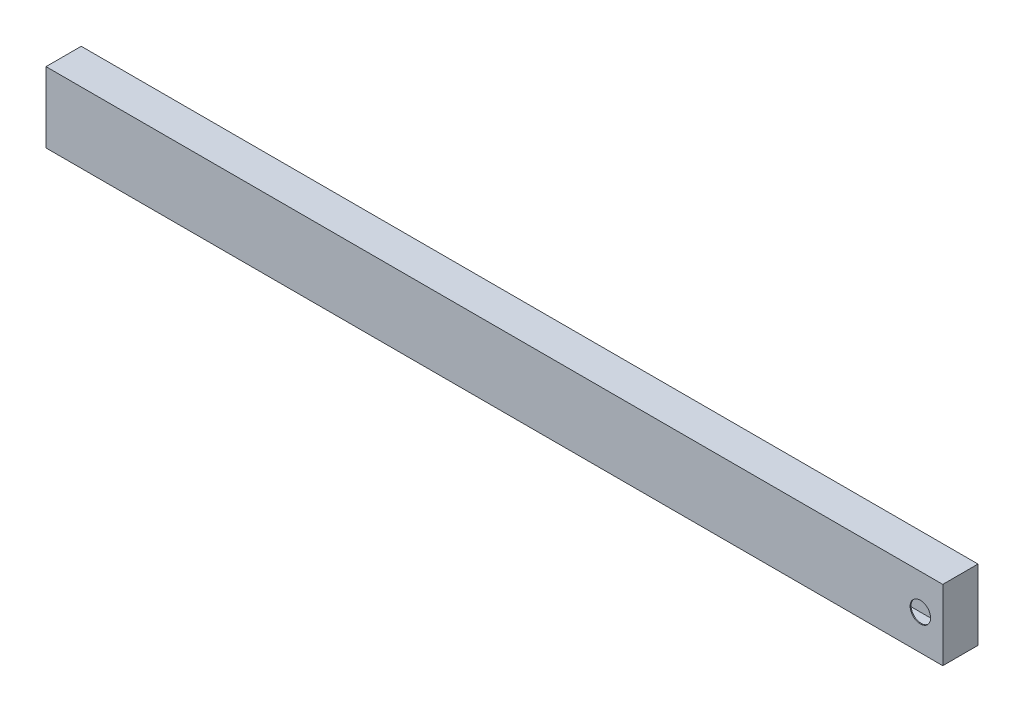
ISO-10303-21;
HEADER;
FILE_DESCRIPTION(('STEP AP214'),'2;1');
FILE_NAME('part.step','',(''),(''),'','','');
FILE_SCHEMA(('AUTOMOTIVE_DESIGN { 1 0 10303 214 1 1 1 1 }'));
ENDSEC;
DATA;
#1=APPLICATION_CONTEXT('core data for automotive mechanical design processes');
#2=APPLICATION_PROTOCOL_DEFINITION('international standard','automotive_design',2000,#1);
#3=PRODUCT_CONTEXT('',#1,'mechanical');
#4=PRODUCT('Part','Part','',(#3));
#5=PRODUCT_RELATED_PRODUCT_CATEGORY('part','',(#4));
#6=PRODUCT_DEFINITION_FORMATION('','',#4);
#7=PRODUCT_DEFINITION_CONTEXT('part definition',#1,'design');
#8=PRODUCT_DEFINITION('design','',#6,#7);
#9=PRODUCT_DEFINITION_SHAPE('','',#8);
#10=(LENGTH_UNIT() NAMED_UNIT(*) SI_UNIT(.MILLI.,.METRE.));
#11=(NAMED_UNIT(*) PLANE_ANGLE_UNIT() SI_UNIT($,.RADIAN.));
#12=(NAMED_UNIT(*) SI_UNIT($,.STERADIAN.) SOLID_ANGLE_UNIT());
#13=UNCERTAINTY_MEASURE_WITH_UNIT(LENGTH_MEASURE(1.E-05),#10,'distance_accuracy_value','');
#14=(GEOMETRIC_REPRESENTATION_CONTEXT(3) GLOBAL_UNCERTAINTY_ASSIGNED_CONTEXT((#13)) GLOBAL_UNIT_ASSIGNED_CONTEXT((#10,
#11,#12)) REPRESENTATION_CONTEXT('',''));
#15=CARTESIAN_POINT('',(0.,0.,0.));
#16=DIRECTION('',(0.,0.,1.));
#17=DIRECTION('',(1.,0.,0.));
#18=AXIS2_PLACEMENT_3D('',#15,#16,#17);
#19=CARTESIAN_POINT('',(0.,110.,0.));
#20=DIRECTION('',(-1.,0.,0.));
#21=DIRECTION('',(0.,0.,1.));
#22=AXIS2_PLACEMENT_3D('',#19,#20,#21);
#23=PLANE('',#22);
#24=DIRECTION('',(0.,0.,-1.));
#25=VECTOR('',#24,1.);
#26=CARTESIAN_POINT('',(0.,0.,0.));
#27=LINE('',#26,#25);
#28=CARTESIAN_POINT('',(0.,0.,0.));
#29=VERTEX_POINT('',#28);
#30=CARTESIAN_POINT('',(0.,0.,-55.));
#31=VERTEX_POINT('',#30);
#32=EDGE_CURVE('E227',#29,#31,#27,.T.);
#33=ORIENTED_EDGE('',*,*,#32,.T.);
#34=DIRECTION('',(0.,-1.,0.));
#35=VECTOR('',#34,1.);
#36=CARTESIAN_POINT('',(0.,110.,-55.));
#37=LINE('',#36,#35);
#38=CARTESIAN_POINT('',(0.,110.,-55.));
#39=VERTEX_POINT('',#38);
#40=EDGE_CURVE('E11',#39,#31,#37,.T.);
#41=ORIENTED_EDGE('',*,*,#40,.F.);
#42=DIRECTION('',(0.,0.,-1.));
#43=VECTOR('',#42,1.);
#44=CARTESIAN_POINT('',(0.,110.,0.));
#45=LINE('',#44,#43);
#46=CARTESIAN_POINT('',(0.,110.,0.));
#47=VERTEX_POINT('',#46);
#48=EDGE_CURVE('E275',#47,#39,#45,.T.);
#49=ORIENTED_EDGE('',*,*,#48,.F.);
#50=DIRECTION('',(0.,-1.,0.));
#51=VECTOR('',#50,1.);
#52=CARTESIAN_POINT('',(0.,110.,0.));
#53=LINE('',#52,#51);
#54=EDGE_CURVE('E285',#47,#29,#53,.T.);
#55=ORIENTED_EDGE('',*,*,#54,.T.);
#56=EDGE_LOOP('',(#33,#41,#49,#55));
#57=FACE_BOUND('',#56,.T.);
#58=ADVANCED_FACE('F39',(#57),#23,.F.);
#59=CARTESIAN_POINT('',(0.,110.,-55.));
#60=DIRECTION('',(0.,0.,1.));
#61=DIRECTION('',(1.,0.,0.));
#62=AXIS2_PLACEMENT_3D('',#59,#60,#61);
#63=PLANE('',#62);
#64=CARTESIAN_POINT('',(-120.,55.,-55.));
#65=DIRECTION('',(0.,0.,-1.));
#66=DIRECTION('',(-1.,0.,0.));
#67=AXIS2_PLACEMENT_3D('',#64,#65,#66);
#68=CIRCLE('',#67,30.);
#69=CARTESIAN_POINT('',(-150.,55.,-55.));
#70=VERTEX_POINT('',#69);
#71=EDGE_CURVE('E223',#70,#70,#68,.T.);
#72=ORIENTED_EDGE('',*,*,#71,.F.);
#73=EDGE_LOOP('',(#72));
#74=FACE_BOUND('',#73,.T.);
#75=CARTESIAN_POINT('',(-960.,55.,-54.9999999999999));
#76=DIRECTION('',(0.,0.,-1.));
#77=DIRECTION('',(-1.,0.,0.));
#78=AXIS2_PLACEMENT_3D('',#75,#76,#77);
#79=CIRCLE('',#78,30.);
#80=CARTESIAN_POINT('',(-990.,55.,-54.9999999999999));
#81=VERTEX_POINT('',#80);
#82=EDGE_CURVE('E237',#81,#81,#79,.T.);
#83=ORIENTED_EDGE('',*,*,#82,.F.);
#84=EDGE_LOOP('',(#83));
#85=FACE_BOUND('',#84,.T.);
#86=CARTESIAN_POINT('',(-1380.,55.,-54.9999999999998));
#87=DIRECTION('',(0.,0.,-1.));
#88=DIRECTION('',(-1.,0.,0.));
#89=AXIS2_PLACEMENT_3D('',#86,#87,#88);
#90=CIRCLE('',#89,2.49999999999991);
#91=CARTESIAN_POINT('',(-1382.5,55.,-54.9999999999998));
#92=VERTEX_POINT('',#91);
#93=EDGE_CURVE('E233',#92,#92,#90,.T.);
#94=ORIENTED_EDGE('',*,*,#93,.F.);
#95=EDGE_LOOP('',(#94));
#96=FACE_BOUND('',#95,.T.);
#97=CARTESIAN_POINT('',(-1065.,55.,-54.9999999999999));
#98=DIRECTION('',(0.,0.,-1.));
#99=DIRECTION('',(-1.,0.,0.));
#100=AXIS2_PLACEMENT_3D('',#97,#98,#99);
#101=CIRCLE('',#100,30.0000000000003);
#102=CARTESIAN_POINT('',(-1095.,55.,-54.9999999999999));
#103=VERTEX_POINT('',#102);
#104=EDGE_CURVE('E229',#103,#103,#101,.T.);
#105=ORIENTED_EDGE('',*,*,#104,.F.);
#106=EDGE_LOOP('',(#105));
#107=FACE_BOUND('',#106,.T.);
#108=CARTESIAN_POINT('',(-1170.,55.,-54.9999999999999));
#109=DIRECTION('',(0.,0.,-1.));
#110=DIRECTION('',(-1.,0.,0.));
#111=AXIS2_PLACEMENT_3D('',#108,#109,#110);
#112=CIRCLE('',#111,30.);
#113=CARTESIAN_POINT('',(-1200.,55.,-54.9999999999999));
#114=VERTEX_POINT('',#113);
#115=EDGE_CURVE('E222',#114,#114,#112,.T.);
#116=ORIENTED_EDGE('',*,*,#115,.F.);
#117=EDGE_LOOP('',(#116));
#118=FACE_BOUND('',#117,.T.);
#119=CARTESIAN_POINT('',(-435.,55.,-54.9999999999999));
#120=DIRECTION('',(0.,0.,-1.));
#121=DIRECTION('',(-1.,0.,0.));
#122=AXIS2_PLACEMENT_3D('',#119,#120,#121);
#123=CIRCLE('',#122,29.9999999999999);
#124=CARTESIAN_POINT('',(-465.,55.,-54.9999999999999));
#125=VERTEX_POINT('',#124);
#126=EDGE_CURVE('E249',#125,#125,#123,.T.);
#127=ORIENTED_EDGE('',*,*,#126,.F.);
#128=EDGE_LOOP('',(#127));
#129=FACE_BOUND('',#128,.T.);
#130=CARTESIAN_POINT('',(-330.,55.,-55.));
#131=DIRECTION('',(0.,0.,-1.));
#132=DIRECTION('',(-1.,0.,0.));
#133=AXIS2_PLACEMENT_3D('',#130,#131,#132);
#134=CIRCLE('',#133,30.0000000000001);
#135=CARTESIAN_POINT('',(-360.,55.,-54.9999999999999));
#136=VERTEX_POINT('',#135);
#137=EDGE_CURVE('E261',#136,#136,#134,.T.);
#138=ORIENTED_EDGE('',*,*,#137,.F.);
#139=EDGE_LOOP('',(#138));
#140=FACE_BOUND('',#139,.T.);
#141=CARTESIAN_POINT('',(-225.,55.,-55.));
#142=DIRECTION('',(0.,0.,-1.));
#143=DIRECTION('',(-1.,0.,0.));
#144=AXIS2_PLACEMENT_3D('',#141,#142,#143);
#145=CIRCLE('',#144,30.);
#146=CARTESIAN_POINT('',(-255.,55.,-55.));
#147=VERTEX_POINT('',#146);
#148=EDGE_CURVE('E265',#147,#147,#145,.T.);
#149=ORIENTED_EDGE('',*,*,#148,.F.);
#150=EDGE_LOOP('',(#149));
#151=FACE_BOUND('',#150,.T.);
#152=CARTESIAN_POINT('',(-1275.,55.,-54.9999999999998));
#153=DIRECTION('',(0.,0.,-1.));
#154=DIRECTION('',(-1.,0.,0.));
#155=AXIS2_PLACEMENT_3D('',#152,#153,#154);
#156=CIRCLE('',#155,29.9999999999998);
#157=CARTESIAN_POINT('',(-1305.,55.,-54.9999999999998));
#158=VERTEX_POINT('',#157);
#159=EDGE_CURVE('E228',#158,#158,#156,.T.);
#160=ORIENTED_EDGE('',*,*,#159,.F.);
#161=EDGE_LOOP('',(#160));
#162=FACE_BOUND('',#161,.T.);
#163=CARTESIAN_POINT('',(-540.,55.,-54.9999999999999));
#164=DIRECTION('',(0.,0.,-1.));
#165=DIRECTION('',(-1.,0.,0.));
#166=AXIS2_PLACEMENT_3D('',#163,#164,#165);
#167=CIRCLE('',#166,29.9999999999999);
#168=CARTESIAN_POINT('',(-570.,55.,-54.9999999999999));
#169=VERTEX_POINT('',#168);
#170=EDGE_CURVE('E245',#169,#169,#167,.T.);
#171=ORIENTED_EDGE('',*,*,#170,.F.);
#172=EDGE_LOOP('',(#171));
#173=FACE_BOUND('',#172,.T.);
#174=CARTESIAN_POINT('',(-645.,55.,-54.9999999999999));
#175=DIRECTION('',(0.,0.,-1.));
#176=DIRECTION('',(-1.,0.,0.));
#177=AXIS2_PLACEMENT_3D('',#174,#175,#176);
#178=CIRCLE('',#177,29.9999999999999);
#179=CARTESIAN_POINT('',(-675.,55.,-54.9999999999999));
#180=VERTEX_POINT('',#179);
#181=EDGE_CURVE('E250',#180,#180,#178,.T.);
#182=ORIENTED_EDGE('',*,*,#181,.F.);
#183=EDGE_LOOP('',(#182));
#184=FACE_BOUND('',#183,.T.);
#185=CARTESIAN_POINT('',(-750.,55.,-54.9999999999999));
#186=DIRECTION('',(0.,0.,-1.));
#187=DIRECTION('',(-1.,0.,0.));
#188=AXIS2_PLACEMENT_3D('',#185,#186,#187);
#189=CIRCLE('',#188,30.0000000000003);
#190=CARTESIAN_POINT('',(-780.,55.,-54.9999999999999));
#191=VERTEX_POINT('',#190);
#192=EDGE_CURVE('E254',#191,#191,#189,.T.);
#193=ORIENTED_EDGE('',*,*,#192,.F.);
#194=EDGE_LOOP('',(#193));
#195=FACE_BOUND('',#194,.T.);
#196=CARTESIAN_POINT('',(-855.,55.,-54.9999999999999));
#197=DIRECTION('',(0.,0.,-1.));
#198=DIRECTION('',(-1.,0.,0.));
#199=AXIS2_PLACEMENT_3D('',#196,#197,#198);
#200=CIRCLE('',#199,30.);
#201=CARTESIAN_POINT('',(-885.,55.,-54.9999999999999));
#202=VERTEX_POINT('',#201);
#203=EDGE_CURVE('E241',#202,#202,#200,.T.);
#204=ORIENTED_EDGE('',*,*,#203,.F.);
#205=EDGE_LOOP('',(#204));
#206=FACE_BOUND('',#205,.T.);
#207=DIRECTION('',(-1.,0.,0.));
#208=VECTOR('',#207,1.);
#209=CARTESIAN_POINT('',(0.,0.,-55.));
#210=LINE('',#209,#208);
#211=CARTESIAN_POINT('',(-1400.,0.,-54.9999999999998));
#212=VERTEX_POINT('',#211);
#213=EDGE_CURVE('E289',#31,#212,#210,.T.);
#214=ORIENTED_EDGE('',*,*,#213,.T.);
#215=DIRECTION('',(0.,-1.,0.));
#216=VECTOR('',#215,1.);
#217=CARTESIAN_POINT('',(-1400.,110.,-54.9999999999998));
#218=LINE('',#217,#216);
#219=CARTESIAN_POINT('',(-1400.,110.,-54.9999999999998));
#220=VERTEX_POINT('',#219);
#221=EDGE_CURVE('E49',#220,#212,#218,.T.);
#222=ORIENTED_EDGE('',*,*,#221,.F.);
#223=DIRECTION('',(-1.,0.,0.));
#224=VECTOR('',#223,1.);
#225=CARTESIAN_POINT('',(0.,110.,-55.));
#226=LINE('',#225,#224);
#227=EDGE_CURVE('E89',#39,#220,#226,.T.);
#228=ORIENTED_EDGE('',*,*,#227,.F.);
#229=ORIENTED_EDGE('',*,*,#40,.T.);
#230=EDGE_LOOP('',(#214,#222,#228,#229));
#231=FACE_BOUND('',#230,.T.);
#232=ADVANCED_FACE('F333',(#74,#85,#96,#107,#118,#129,#140,#151,#162,#173,#184,#195,#206,#231),
#63,.F.);
#233=CARTESIAN_POINT('',(-1400.,110.,0.));
#234=DIRECTION('',(1.,0.,0.));
#235=DIRECTION('',(0.,0.,-1.));
#236=AXIS2_PLACEMENT_3D('',#233,#234,#235);
#237=PLANE('',#236);
#238=DIRECTION('',(0.,0.,1.));
#239=VECTOR('',#238,1.);
#240=CARTESIAN_POINT('',(-1400.,0.,0.));
#241=LINE('',#240,#239);
#242=CARTESIAN_POINT('',(-1400.,0.,0.));
#243=VERTEX_POINT('',#242);
#244=EDGE_CURVE('E76',#212,#243,#241,.T.);
#245=ORIENTED_EDGE('',*,*,#244,.T.);
#246=DIRECTION('',(0.,-1.,0.));
#247=VECTOR('',#246,1.);
#248=CARTESIAN_POINT('',(-1400.,110.,0.));
#249=LINE('',#248,#247);
#250=CARTESIAN_POINT('',(-1400.,110.,0.));
#251=VERTEX_POINT('',#250);
#252=EDGE_CURVE('E298',#251,#243,#249,.T.);
#253=ORIENTED_EDGE('',*,*,#252,.F.);
#254=DIRECTION('',(0.,0.,1.));
#255=VECTOR('',#254,1.);
#256=CARTESIAN_POINT('',(-1400.,110.,0.));
#257=LINE('',#256,#255);
#258=EDGE_CURVE('E280',#220,#251,#257,.T.);
#259=ORIENTED_EDGE('',*,*,#258,.F.);
#260=ORIENTED_EDGE('',*,*,#221,.T.);
#261=EDGE_LOOP('',(#245,#253,#259,#260));
#262=FACE_BOUND('',#261,.T.);
#263=ADVANCED_FACE('F335',(#262),#237,.F.);
#264=CARTESIAN_POINT('',(0.,110.,0.));
#265=DIRECTION('',(0.,0.,-1.));
#266=DIRECTION('',(-1.,0.,0.));
#267=AXIS2_PLACEMENT_3D('',#264,#265,#266);
#268=PLANE('',#267);
#269=CARTESIAN_POINT('',(-35.,55.,0.));
#270=DIRECTION('',(0.,0.,1.));
#271=DIRECTION('',(1.,0.,0.));
#272=AXIS2_PLACEMENT_3D('',#269,#270,#271);
#273=CIRCLE('',#272,16.);
#274=CARTESIAN_POINT('',(-19.,55.,0.));
#275=VERTEX_POINT('',#274);
#276=EDGE_CURVE('E151',#275,#275,#273,.T.);
#277=ORIENTED_EDGE('',*,*,#276,.F.);
#278=EDGE_LOOP('',(#277));
#279=FACE_BOUND('',#278,.T.);
#280=DIRECTION('',(1.,0.,0.));
#281=VECTOR('',#280,1.);
#282=CARTESIAN_POINT('',(0.,0.,0.));
#283=LINE('',#282,#281);
#284=EDGE_CURVE('E82',#243,#29,#283,.T.);
#285=ORIENTED_EDGE('',*,*,#284,.T.);
#286=ORIENTED_EDGE('',*,*,#54,.F.);
#287=DIRECTION('',(1.,0.,0.));
#288=VECTOR('',#287,1.);
#289=CARTESIAN_POINT('',(0.,110.,0.));
#290=LINE('',#289,#288);
#291=EDGE_CURVE('E58',#251,#47,#290,.T.);
#292=ORIENTED_EDGE('',*,*,#291,.F.);
#293=ORIENTED_EDGE('',*,*,#252,.T.);
#294=EDGE_LOOP('',(#285,#286,#292,#293));
#295=FACE_BOUND('',#294,.T.);
#296=ADVANCED_FACE('F343',(#279,#295),#268,.F.);
#297=CARTESIAN_POINT('',(0.,110.,0.));
#298=DIRECTION('',(0.,1.,0.));
#299=DIRECTION('',(0.,0.,1.));
#300=AXIS2_PLACEMENT_3D('',#297,#298,#299);
#301=PLANE('',#300);
#302=ORIENTED_EDGE('',*,*,#48,.T.);
#303=ORIENTED_EDGE('',*,*,#227,.T.);
#304=ORIENTED_EDGE('',*,*,#258,.T.);
#305=ORIENTED_EDGE('',*,*,#291,.T.);
#306=EDGE_LOOP('',(#302,#303,#304,#305));
#307=FACE_BOUND('',#306,.T.);
#308=ADVANCED_FACE('F345',(#307),#301,.T.);
#309=CARTESIAN_POINT('',(0.,0.,0.));
#310=DIRECTION('',(0.,1.,0.));
#311=DIRECTION('',(0.,0.,1.));
#312=AXIS2_PLACEMENT_3D('',#309,#310,#311);
#313=PLANE('',#312);
#314=ORIENTED_EDGE('',*,*,#32,.F.);
#315=ORIENTED_EDGE('',*,*,#284,.F.);
#316=ORIENTED_EDGE('',*,*,#244,.F.);
#317=ORIENTED_EDGE('',*,*,#213,.F.);
#318=EDGE_LOOP('',(#314,#315,#316,#317));
#319=FACE_BOUND('',#318,.T.);
#320=ADVANCED_FACE('F329',(#319),#313,.F.);
#321=CARTESIAN_POINT('',(-855.,55.,-44.9999999999999));
#322=DIRECTION('',(0.,0.,-1.));
#323=DIRECTION('',(-1.,0.,0.));
#324=AXIS2_PLACEMENT_3D('',#321,#322,#323);
#325=CYLINDRICAL_SURFACE('',#324,30.);
#326=CARTESIAN_POINT('',(-855.,55.,-53.5));
#327=DIRECTION('',(0.,0.,-1.));
#328=DIRECTION('',(-1.,0.,0.));
#329=AXIS2_PLACEMENT_3D('',#326,#327,#328);
#330=CIRCLE('',#329,30.);
#331=CARTESIAN_POINT('',(-885.,55.,-53.5));
#332=VERTEX_POINT('',#331);
#333=EDGE_CURVE('E218',#332,#332,#330,.F.);
#334=ORIENTED_EDGE('',*,*,#333,.T.);
#335=EDGE_LOOP('',(#334));
#336=FACE_BOUND('',#335,.T.);
#337=ORIENTED_EDGE('',*,*,#203,.T.);
#338=EDGE_LOOP('',(#337));
#339=FACE_BOUND('',#338,.T.);
#340=ADVANCED_FACE('F325',(#336,#339),#325,.F.);
#341=CARTESIAN_POINT('',(-750.,55.,-44.9999999999999));
#342=DIRECTION('',(0.,0.,-1.));
#343=DIRECTION('',(-1.,0.,0.));
#344=AXIS2_PLACEMENT_3D('',#341,#342,#343);
#345=CYLINDRICAL_SURFACE('',#344,30.0000000000003);
#346=CARTESIAN_POINT('',(-750.,55.,-53.5));
#347=DIRECTION('',(0.,0.,-1.));
#348=DIRECTION('',(-1.,0.,0.));
#349=AXIS2_PLACEMENT_3D('',#346,#347,#348);
#350=CIRCLE('',#349,30.0000000000003);
#351=CARTESIAN_POINT('',(-780.,55.,-53.5));
#352=VERTEX_POINT('',#351);
#353=EDGE_CURVE('E214',#352,#352,#350,.F.);
#354=ORIENTED_EDGE('',*,*,#353,.T.);
#355=EDGE_LOOP('',(#354));
#356=FACE_BOUND('',#355,.T.);
#357=ORIENTED_EDGE('',*,*,#192,.T.);
#358=EDGE_LOOP('',(#357));
#359=FACE_BOUND('',#358,.T.);
#360=ADVANCED_FACE('F328',(#356,#359),#345,.F.);
#361=CARTESIAN_POINT('',(-645.,55.,-44.9999999999999));
#362=DIRECTION('',(0.,0.,-1.));
#363=DIRECTION('',(-1.,0.,0.));
#364=AXIS2_PLACEMENT_3D('',#361,#362,#363);
#365=CYLINDRICAL_SURFACE('',#364,29.9999999999999);
#366=CARTESIAN_POINT('',(-645.,55.,-53.5));
#367=DIRECTION('',(0.,0.,-1.));
#368=DIRECTION('',(-1.,0.,0.));
#369=AXIS2_PLACEMENT_3D('',#366,#367,#368);
#370=CIRCLE('',#369,29.9999999999999);
#371=CARTESIAN_POINT('',(-675.,55.,-53.5));
#372=VERTEX_POINT('',#371);
#373=EDGE_CURVE('E210',#372,#372,#370,.F.);
#374=ORIENTED_EDGE('',*,*,#373,.T.);
#375=EDGE_LOOP('',(#374));
#376=FACE_BOUND('',#375,.T.);
#377=ORIENTED_EDGE('',*,*,#181,.T.);
#378=EDGE_LOOP('',(#377));
#379=FACE_BOUND('',#378,.T.);
#380=ADVANCED_FACE('F393',(#376,#379),#365,.F.);
#381=CARTESIAN_POINT('',(-540.,55.,-44.9999999999999));
#382=DIRECTION('',(0.,0.,-1.));
#383=DIRECTION('',(-1.,0.,0.));
#384=AXIS2_PLACEMENT_3D('',#381,#382,#383);
#385=CYLINDRICAL_SURFACE('',#384,29.9999999999999);
#386=CARTESIAN_POINT('',(-540.,55.,-53.5));
#387=DIRECTION('',(0.,0.,-1.));
#388=DIRECTION('',(-1.,0.,0.));
#389=AXIS2_PLACEMENT_3D('',#386,#387,#388);
#390=CIRCLE('',#389,29.9999999999999);
#391=CARTESIAN_POINT('',(-570.,55.,-53.5));
#392=VERTEX_POINT('',#391);
#393=EDGE_CURVE('E206',#392,#392,#390,.F.);
#394=ORIENTED_EDGE('',*,*,#393,.T.);
#395=EDGE_LOOP('',(#394));
#396=FACE_BOUND('',#395,.T.);
#397=ORIENTED_EDGE('',*,*,#170,.T.);
#398=EDGE_LOOP('',(#397));
#399=FACE_BOUND('',#398,.T.);
#400=ADVANCED_FACE('F401',(#396,#399),#385,.F.);
#401=CARTESIAN_POINT('',(-1275.,55.,-44.9999999999998));
#402=DIRECTION('',(0.,0.,-1.));
#403=DIRECTION('',(-1.,0.,0.));
#404=AXIS2_PLACEMENT_3D('',#401,#402,#403);
#405=CYLINDRICAL_SURFACE('',#404,29.9999999999998);
#406=CARTESIAN_POINT('',(-1275.,55.,-53.5));
#407=DIRECTION('',(0.,0.,-1.));
#408=DIRECTION('',(-1.,0.,0.));
#409=AXIS2_PLACEMENT_3D('',#406,#407,#408);
#410=CIRCLE('',#409,29.9999999999998);
#411=CARTESIAN_POINT('',(-1305.,55.,-53.5));
#412=VERTEX_POINT('',#411);
#413=EDGE_CURVE('E202',#412,#412,#410,.F.);
#414=ORIENTED_EDGE('',*,*,#413,.T.);
#415=EDGE_LOOP('',(#414));
#416=FACE_BOUND('',#415,.T.);
#417=ORIENTED_EDGE('',*,*,#159,.T.);
#418=EDGE_LOOP('',(#417));
#419=FACE_BOUND('',#418,.T.);
#420=ADVANCED_FACE('F409',(#416,#419),#405,.F.);
#421=CARTESIAN_POINT('',(-225.,55.,-45.));
#422=DIRECTION('',(0.,0.,-1.));
#423=DIRECTION('',(-1.,0.,0.));
#424=AXIS2_PLACEMENT_3D('',#421,#422,#423);
#425=CYLINDRICAL_SURFACE('',#424,30.);
#426=CARTESIAN_POINT('',(-225.,55.,-53.5));
#427=DIRECTION('',(0.,0.,-1.));
#428=DIRECTION('',(-1.,0.,0.));
#429=AXIS2_PLACEMENT_3D('',#426,#427,#428);
#430=CIRCLE('',#429,30.);
#431=CARTESIAN_POINT('',(-255.,55.,-53.5));
#432=VERTEX_POINT('',#431);
#433=EDGE_CURVE('E198',#432,#432,#430,.F.);
#434=ORIENTED_EDGE('',*,*,#433,.T.);
#435=EDGE_LOOP('',(#434));
#436=FACE_BOUND('',#435,.T.);
#437=ORIENTED_EDGE('',*,*,#148,.T.);
#438=EDGE_LOOP('',(#437));
#439=FACE_BOUND('',#438,.T.);
#440=ADVANCED_FACE('F417',(#436,#439),#425,.F.);
#441=CARTESIAN_POINT('',(-330.,55.,-45.));
#442=DIRECTION('',(0.,0.,-1.));
#443=DIRECTION('',(-1.,0.,0.));
#444=AXIS2_PLACEMENT_3D('',#441,#442,#443);
#445=CYLINDRICAL_SURFACE('',#444,30.0000000000001);
#446=CARTESIAN_POINT('',(-330.,55.,-53.5));
#447=DIRECTION('',(0.,0.,-1.));
#448=DIRECTION('',(-1.,0.,0.));
#449=AXIS2_PLACEMENT_3D('',#446,#447,#448);
#450=CIRCLE('',#449,30.0000000000001);
#451=CARTESIAN_POINT('',(-360.,55.,-53.5));
#452=VERTEX_POINT('',#451);
#453=EDGE_CURVE('E194',#452,#452,#450,.F.);
#454=ORIENTED_EDGE('',*,*,#453,.T.);
#455=EDGE_LOOP('',(#454));
#456=FACE_BOUND('',#455,.T.);
#457=ORIENTED_EDGE('',*,*,#137,.T.);
#458=EDGE_LOOP('',(#457));
#459=FACE_BOUND('',#458,.T.);
#460=ADVANCED_FACE('F425',(#456,#459),#445,.F.);
#461=CARTESIAN_POINT('',(-435.,55.,-44.9999999999999));
#462=DIRECTION('',(0.,0.,-1.));
#463=DIRECTION('',(-1.,0.,0.));
#464=AXIS2_PLACEMENT_3D('',#461,#462,#463);
#465=CYLINDRICAL_SURFACE('',#464,29.9999999999999);
#466=CARTESIAN_POINT('',(-435.,55.,-53.5));
#467=DIRECTION('',(0.,0.,-1.));
#468=DIRECTION('',(-1.,0.,0.));
#469=AXIS2_PLACEMENT_3D('',#466,#467,#468);
#470=CIRCLE('',#469,29.9999999999999);
#471=CARTESIAN_POINT('',(-465.,55.,-53.5));
#472=VERTEX_POINT('',#471);
#473=EDGE_CURVE('E190',#472,#472,#470,.F.);
#474=ORIENTED_EDGE('',*,*,#473,.T.);
#475=EDGE_LOOP('',(#474));
#476=FACE_BOUND('',#475,.T.);
#477=ORIENTED_EDGE('',*,*,#126,.T.);
#478=EDGE_LOOP('',(#477));
#479=FACE_BOUND('',#478,.T.);
#480=ADVANCED_FACE('F433',(#476,#479),#465,.F.);
#481=CARTESIAN_POINT('',(-1170.,55.,-44.9999999999999));
#482=DIRECTION('',(0.,0.,-1.));
#483=DIRECTION('',(-1.,0.,0.));
#484=AXIS2_PLACEMENT_3D('',#481,#482,#483);
#485=CYLINDRICAL_SURFACE('',#484,30.);
#486=CARTESIAN_POINT('',(-1170.,55.,-53.5));
#487=DIRECTION('',(0.,0.,-1.));
#488=DIRECTION('',(-1.,0.,0.));
#489=AXIS2_PLACEMENT_3D('',#486,#487,#488);
#490=CIRCLE('',#489,30.);
#491=CARTESIAN_POINT('',(-1200.,55.,-53.5));
#492=VERTEX_POINT('',#491);
#493=EDGE_CURVE('E186',#492,#492,#490,.F.);
#494=ORIENTED_EDGE('',*,*,#493,.T.);
#495=EDGE_LOOP('',(#494));
#496=FACE_BOUND('',#495,.T.);
#497=ORIENTED_EDGE('',*,*,#115,.T.);
#498=EDGE_LOOP('',(#497));
#499=FACE_BOUND('',#498,.T.);
#500=ADVANCED_FACE('F441',(#496,#499),#485,.F.);
#501=CARTESIAN_POINT('',(-1065.,55.,-44.9999999999999));
#502=DIRECTION('',(0.,0.,-1.));
#503=DIRECTION('',(-1.,0.,0.));
#504=AXIS2_PLACEMENT_3D('',#501,#502,#503);
#505=CYLINDRICAL_SURFACE('',#504,30.0000000000003);
#506=CARTESIAN_POINT('',(-1065.,55.,-53.5));
#507=DIRECTION('',(0.,0.,-1.));
#508=DIRECTION('',(-1.,0.,0.));
#509=AXIS2_PLACEMENT_3D('',#506,#507,#508);
#510=CIRCLE('',#509,30.0000000000003);
#511=CARTESIAN_POINT('',(-1095.,55.,-53.5));
#512=VERTEX_POINT('',#511);
#513=EDGE_CURVE('E182',#512,#512,#510,.F.);
#514=ORIENTED_EDGE('',*,*,#513,.T.);
#515=EDGE_LOOP('',(#514));
#516=FACE_BOUND('',#515,.T.);
#517=ORIENTED_EDGE('',*,*,#104,.T.);
#518=EDGE_LOOP('',(#517));
#519=FACE_BOUND('',#518,.T.);
#520=ADVANCED_FACE('F449',(#516,#519),#505,.F.);
#521=CARTESIAN_POINT('',(-1380.,55.,-44.9999999999998));
#522=DIRECTION('',(0.,0.,-1.));
#523=DIRECTION('',(-1.,0.,0.));
#524=AXIS2_PLACEMENT_3D('',#521,#522,#523);
#525=CYLINDRICAL_SURFACE('',#524,2.49999999999991);
#526=CARTESIAN_POINT('',(-1380.,55.,-53.5));
#527=DIRECTION('',(0.,0.,-1.));
#528=DIRECTION('',(-1.,0.,0.));
#529=AXIS2_PLACEMENT_3D('',#526,#527,#528);
#530=CIRCLE('',#529,2.49999999999991);
#531=CARTESIAN_POINT('',(-1382.5,55.,-53.5));
#532=VERTEX_POINT('',#531);
#533=EDGE_CURVE('E178',#532,#532,#530,.F.);
#534=ORIENTED_EDGE('',*,*,#533,.T.);
#535=EDGE_LOOP('',(#534));
#536=FACE_BOUND('',#535,.T.);
#537=ORIENTED_EDGE('',*,*,#93,.T.);
#538=EDGE_LOOP('',(#537));
#539=FACE_BOUND('',#538,.T.);
#540=ADVANCED_FACE('F457',(#536,#539),#525,.F.);
#541=CARTESIAN_POINT('',(-960.,55.,-44.9999999999999));
#542=DIRECTION('',(0.,0.,-1.));
#543=DIRECTION('',(-1.,0.,0.));
#544=AXIS2_PLACEMENT_3D('',#541,#542,#543);
#545=CYLINDRICAL_SURFACE('',#544,30.);
#546=CARTESIAN_POINT('',(-960.,55.,-53.5));
#547=DIRECTION('',(0.,0.,-1.));
#548=DIRECTION('',(-1.,0.,0.));
#549=AXIS2_PLACEMENT_3D('',#546,#547,#548);
#550=CIRCLE('',#549,30.);
#551=CARTESIAN_POINT('',(-990.,55.,-53.5));
#552=VERTEX_POINT('',#551);
#553=EDGE_CURVE('E174',#552,#552,#550,.F.);
#554=ORIENTED_EDGE('',*,*,#553,.T.);
#555=EDGE_LOOP('',(#554));
#556=FACE_BOUND('',#555,.T.);
#557=ORIENTED_EDGE('',*,*,#82,.T.);
#558=EDGE_LOOP('',(#557));
#559=FACE_BOUND('',#558,.T.);
#560=ADVANCED_FACE('F465',(#556,#559),#545,.F.);
#561=CARTESIAN_POINT('',(-120.,55.,-45.));
#562=DIRECTION('',(0.,0.,-1.));
#563=DIRECTION('',(-1.,0.,0.));
#564=AXIS2_PLACEMENT_3D('',#561,#562,#563);
#565=CYLINDRICAL_SURFACE('',#564,30.);
#566=CARTESIAN_POINT('',(-120.,55.,-53.5));
#567=DIRECTION('',(0.,0.,-1.));
#568=DIRECTION('',(-1.,0.,0.));
#569=AXIS2_PLACEMENT_3D('',#566,#567,#568);
#570=CIRCLE('',#569,30.);
#571=CARTESIAN_POINT('',(-150.,55.,-53.5));
#572=VERTEX_POINT('',#571);
#573=EDGE_CURVE('E168',#572,#572,#570,.F.);
#574=ORIENTED_EDGE('',*,*,#573,.T.);
#575=EDGE_LOOP('',(#574));
#576=FACE_BOUND('',#575,.T.);
#577=ORIENTED_EDGE('',*,*,#71,.T.);
#578=EDGE_LOOP('',(#577));
#579=FACE_BOUND('',#578,.T.);
#580=ADVANCED_FACE('F306',(#576,#579),#565,.F.);
#581=CARTESIAN_POINT('',(-1397.,108.5,-53.5));
#582=DIRECTION('',(0.,0.,-1.));
#583=DIRECTION('',(-1.,0.,0.));
#584=AXIS2_PLACEMENT_3D('',#581,#582,#583);
#585=PLANE('',#584);
#586=ORIENTED_EDGE('',*,*,#353,.F.);
#587=EDGE_LOOP('',(#586));
#588=FACE_BOUND('',#587,.T.);
#589=ORIENTED_EDGE('',*,*,#393,.F.);
#590=EDGE_LOOP('',(#589));
#591=FACE_BOUND('',#590,.T.);
#592=ORIENTED_EDGE('',*,*,#433,.F.);
#593=EDGE_LOOP('',(#592));
#594=FACE_BOUND('',#593,.T.);
#595=ORIENTED_EDGE('',*,*,#473,.F.);
#596=EDGE_LOOP('',(#595));
#597=FACE_BOUND('',#596,.T.);
#598=ORIENTED_EDGE('',*,*,#513,.F.);
#599=EDGE_LOOP('',(#598));
#600=FACE_BOUND('',#599,.T.);
#601=ORIENTED_EDGE('',*,*,#553,.F.);
#602=EDGE_LOOP('',(#601));
#603=FACE_BOUND('',#602,.T.);
#604=DIRECTION('',(0.,1.,0.));
#605=VECTOR('',#604,1.);
#606=CARTESIAN_POINT('',(-3.,108.5,-53.5));
#607=LINE('',#606,#605);
#608=CARTESIAN_POINT('',(-3.,1.5,-53.5));
#609=VERTEX_POINT('',#608);
#610=CARTESIAN_POINT('',(-3.,108.5,-53.5));
#611=VERTEX_POINT('',#610);
#612=EDGE_CURVE('E124',#609,#611,#607,.T.);
#613=ORIENTED_EDGE('',*,*,#612,.T.);
#614=DIRECTION('',(1.,0.,0.));
#615=VECTOR('',#614,1.);
#616=CARTESIAN_POINT('',(-1397.,108.5,-53.5));
#617=LINE('',#616,#615);
#618=CARTESIAN_POINT('',(-1397.,108.5,-53.5));
#619=VERTEX_POINT('',#618);
#620=EDGE_CURVE('E116',#619,#611,#617,.T.);
#621=ORIENTED_EDGE('',*,*,#620,.F.);
#622=DIRECTION('',(0.,1.,0.));
#623=VECTOR('',#622,1.);
#624=CARTESIAN_POINT('',(-1397.,108.5,-53.5));
#625=LINE('',#624,#623);
#626=CARTESIAN_POINT('',(-1397.,1.5,-53.5));
#627=VERTEX_POINT('',#626);
#628=EDGE_CURVE('E121',#627,#619,#625,.T.);
#629=ORIENTED_EDGE('',*,*,#628,.F.);
#630=DIRECTION('',(1.,0.,0.));
#631=VECTOR('',#630,1.);
#632=CARTESIAN_POINT('',(-1397.,1.5,-53.5));
#633=LINE('',#632,#631);
#634=EDGE_CURVE('E165',#627,#609,#633,.T.);
#635=ORIENTED_EDGE('',*,*,#634,.T.);
#636=EDGE_LOOP('',(#613,#621,#629,#635));
#637=FACE_BOUND('',#636,.T.);
#638=ORIENTED_EDGE('',*,*,#573,.F.);
#639=EDGE_LOOP('',(#638));
#640=FACE_BOUND('',#639,.T.);
#641=ORIENTED_EDGE('',*,*,#533,.F.);
#642=EDGE_LOOP('',(#641));
#643=FACE_BOUND('',#642,.T.);
#644=ORIENTED_EDGE('',*,*,#493,.F.);
#645=EDGE_LOOP('',(#644));
#646=FACE_BOUND('',#645,.T.);
#647=ORIENTED_EDGE('',*,*,#453,.F.);
#648=EDGE_LOOP('',(#647));
#649=FACE_BOUND('',#648,.T.);
#650=ORIENTED_EDGE('',*,*,#413,.F.);
#651=EDGE_LOOP('',(#650));
#652=FACE_BOUND('',#651,.T.);
#653=ORIENTED_EDGE('',*,*,#373,.F.);
#654=EDGE_LOOP('',(#653));
#655=FACE_BOUND('',#654,.T.);
#656=ORIENTED_EDGE('',*,*,#333,.F.);
#657=EDGE_LOOP('',(#656));
#658=FACE_BOUND('',#657,.T.);
#659=ADVANCED_FACE('F118',(#588,#591,#594,#597,#600,#603,#637,#640,#643,#646,#649,#652,#655,
#658),#585,.F.);
#660=CARTESIAN_POINT('',(-1397.,1.5,-53.5));
#661=DIRECTION('',(0.,-1.,0.));
#662=DIRECTION('',(0.,0.,-1.));
#663=AXIS2_PLACEMENT_3D('',#660,#661,#662);
#664=PLANE('',#663);
#665=DIRECTION('',(0.,0.,-1.));
#666=VECTOR('',#665,1.);
#667=CARTESIAN_POINT('',(-3.,1.5,-53.5));
#668=LINE('',#667,#666);
#669=CARTESIAN_POINT('',(-3.,1.5,-1.5));
#670=VERTEX_POINT('',#669);
#671=EDGE_CURVE('E144',#670,#609,#668,.T.);
#672=ORIENTED_EDGE('',*,*,#671,.T.);
#673=ORIENTED_EDGE('',*,*,#634,.F.);
#674=DIRECTION('',(0.,0.,-1.));
#675=VECTOR('',#674,1.);
#676=CARTESIAN_POINT('',(-1397.,1.5,-53.5));
#677=LINE('',#676,#675);
#678=CARTESIAN_POINT('',(-1397.,1.5,-1.5));
#679=VERTEX_POINT('',#678);
#680=EDGE_CURVE('E130',#679,#627,#677,.T.);
#681=ORIENTED_EDGE('',*,*,#680,.F.);
#682=DIRECTION('',(1.,0.,0.));
#683=VECTOR('',#682,1.);
#684=CARTESIAN_POINT('',(-1397.,1.5,-1.5));
#685=LINE('',#684,#683);
#686=EDGE_CURVE('E169',#679,#670,#685,.T.);
#687=ORIENTED_EDGE('',*,*,#686,.T.);
#688=EDGE_LOOP('',(#672,#673,#681,#687));
#689=FACE_BOUND('',#688,.T.);
#690=ADVANCED_FACE('F310',(#689),#664,.F.);
#691=CARTESIAN_POINT('',(-1397.,108.5,-1.5));
#692=DIRECTION('',(0.,0.,1.));
#693=DIRECTION('',(1.,0.,0.));
#694=AXIS2_PLACEMENT_3D('',#691,#692,#693);
#695=PLANE('',#694);
#696=CARTESIAN_POINT('',(-35.,55.,-1.5));
#697=DIRECTION('',(0.,0.,1.));
#698=DIRECTION('',(1.,0.,0.));
#699=AXIS2_PLACEMENT_3D('',#696,#697,#698);
#700=CIRCLE('',#699,16.);
#701=CARTESIAN_POINT('',(-19.,55.,-1.5));
#702=VERTEX_POINT('',#701);
#703=EDGE_CURVE('E42',#702,#702,#700,.T.);
#704=ORIENTED_EDGE('',*,*,#703,.T.);
#705=EDGE_LOOP('',(#704));
#706=FACE_BOUND('',#705,.T.);
#707=DIRECTION('',(0.,-1.,0.));
#708=VECTOR('',#707,1.);
#709=CARTESIAN_POINT('',(-3.,108.5,-1.5));
#710=LINE('',#709,#708);
#711=CARTESIAN_POINT('',(-3.,108.5,-1.5));
#712=VERTEX_POINT('',#711);
#713=EDGE_CURVE('E148',#712,#670,#710,.T.);
#714=ORIENTED_EDGE('',*,*,#713,.T.);
#715=ORIENTED_EDGE('',*,*,#686,.F.);
#716=DIRECTION('',(0.,-1.,0.));
#717=VECTOR('',#716,1.);
#718=CARTESIAN_POINT('',(-1397.,108.5,-1.5));
#719=LINE('',#718,#717);
#720=CARTESIAN_POINT('',(-1397.,108.5,-1.5));
#721=VERTEX_POINT('',#720);
#722=EDGE_CURVE('E139',#721,#679,#719,.T.);
#723=ORIENTED_EDGE('',*,*,#722,.F.);
#724=DIRECTION('',(1.,0.,0.));
#725=VECTOR('',#724,1.);
#726=CARTESIAN_POINT('',(-1397.,108.5,-1.5));
#727=LINE('',#726,#725);
#728=EDGE_CURVE('E129',#721,#712,#727,.T.);
#729=ORIENTED_EDGE('',*,*,#728,.T.);
#730=EDGE_LOOP('',(#714,#715,#723,#729));
#731=FACE_BOUND('',#730,.T.);
#732=ADVANCED_FACE('F490',(#706,#731),#695,.F.);
#733=CARTESIAN_POINT('',(-1397.,108.5,-53.5));
#734=DIRECTION('',(0.,1.,0.));
#735=DIRECTION('',(0.,0.,1.));
#736=AXIS2_PLACEMENT_3D('',#733,#734,#735);
#737=PLANE('',#736);
#738=DIRECTION('',(0.,0.,1.));
#739=VECTOR('',#738,1.);
#740=CARTESIAN_POINT('',(-3.,108.5,-53.5));
#741=LINE('',#740,#739);
#742=EDGE_CURVE('E159',#611,#712,#741,.T.);
#743=ORIENTED_EDGE('',*,*,#742,.T.);
#744=ORIENTED_EDGE('',*,*,#728,.F.);
#745=DIRECTION('',(0.,0.,1.));
#746=VECTOR('',#745,1.);
#747=CARTESIAN_POINT('',(-1397.,108.5,-53.5));
#748=LINE('',#747,#746);
#749=EDGE_CURVE('E133',#619,#721,#748,.T.);
#750=ORIENTED_EDGE('',*,*,#749,.F.);
#751=ORIENTED_EDGE('',*,*,#620,.T.);
#752=EDGE_LOOP('',(#743,#744,#750,#751));
#753=FACE_BOUND('',#752,.T.);
#754=ADVANCED_FACE('F134',(#753),#737,.F.);
#755=CARTESIAN_POINT('',(-1397.,0.,0.));
#756=DIRECTION('',(-1.,0.,0.));
#757=DIRECTION('',(0.,0.,1.));
#758=AXIS2_PLACEMENT_3D('',#755,#756,#757);
#759=PLANE('',#758);
#760=ORIENTED_EDGE('',*,*,#628,.T.);
#761=ORIENTED_EDGE('',*,*,#749,.T.);
#762=ORIENTED_EDGE('',*,*,#722,.T.);
#763=ORIENTED_EDGE('',*,*,#680,.T.);
#764=EDGE_LOOP('',(#760,#761,#762,#763));
#765=FACE_BOUND('',#764,.T.);
#766=ADVANCED_FACE('F141',(#765),#759,.F.);
#767=CARTESIAN_POINT('',(-3.,0.,0.));
#768=DIRECTION('',(-1.,0.,0.));
#769=DIRECTION('',(0.,0.,1.));
#770=AXIS2_PLACEMENT_3D('',#767,#768,#769);
#771=PLANE('',#770);
#772=ORIENTED_EDGE('',*,*,#612,.F.);
#773=ORIENTED_EDGE('',*,*,#671,.F.);
#774=ORIENTED_EDGE('',*,*,#713,.F.);
#775=ORIENTED_EDGE('',*,*,#742,.F.);
#776=EDGE_LOOP('',(#772,#773,#774,#775));
#777=FACE_BOUND('',#776,.T.);
#778=ADVANCED_FACE('F512',(#777),#771,.T.);
#779=CARTESIAN_POINT('',(-35.,55.,-10.));
#780=DIRECTION('',(0.,0.,1.));
#781=DIRECTION('',(1.,0.,0.));
#782=AXIS2_PLACEMENT_3D('',#779,#780,#781);
#783=CYLINDRICAL_SURFACE('',#782,16.);
#784=ORIENTED_EDGE('',*,*,#276,.T.);
#785=EDGE_LOOP('',(#784));
#786=FACE_BOUND('',#785,.T.);
#787=ORIENTED_EDGE('',*,*,#703,.F.);
#788=EDGE_LOOP('',(#787));
#789=FACE_BOUND('',#788,.T.);
#790=ADVANCED_FACE('F519',(#786,#789),#783,.F.);
#791=CLOSED_SHELL('',(#58,#232,#263,#296,#308,#320,#340,#360,#380,#400,#420,#440,#460,#480,#500,
#520,#540,#560,#580,#659,#690,#732,#754,#766,#778,#790));
#792=MANIFOLD_SOLID_BREP('B2',#791);
#793=ADVANCED_BREP_SHAPE_REPRESENTATION('',(#18,#792),#14);
#794=SHAPE_DEFINITION_REPRESENTATION(#9,#793);
ENDSEC;
END-ISO-10303-21;
